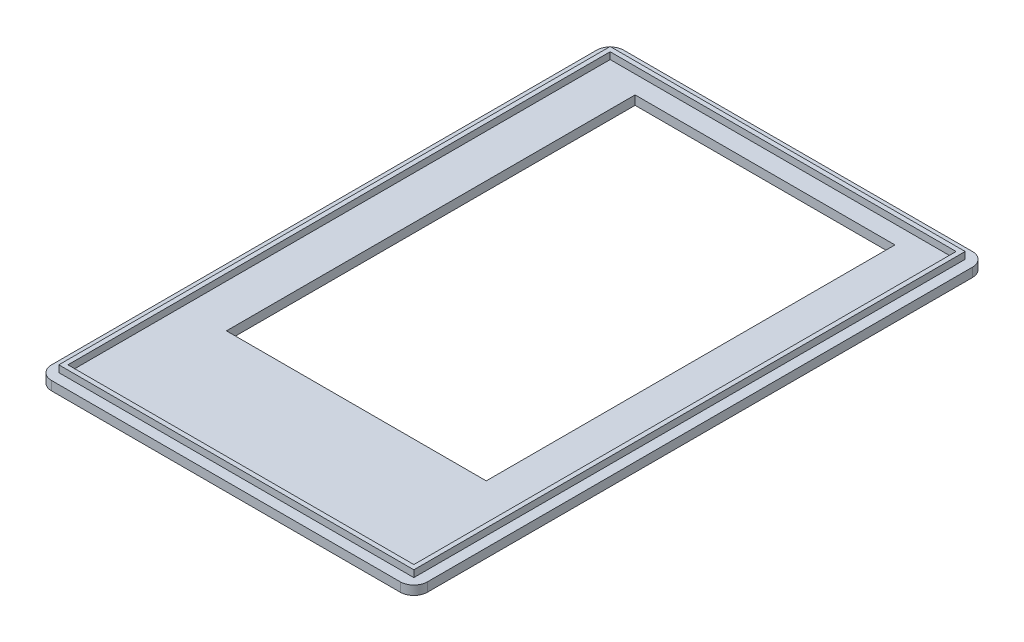
ISO-10303-21;
HEADER;
FILE_DESCRIPTION(('STEP AP214'),'2;1');
FILE_NAME('part.step','',(''),(''),'','','');
FILE_SCHEMA(('AUTOMOTIVE_DESIGN { 1 0 10303 214 1 1 1 1 }'));
ENDSEC;
DATA;
#1=APPLICATION_CONTEXT('core data for automotive mechanical design processes');
#2=APPLICATION_PROTOCOL_DEFINITION('international standard','automotive_design',2000,#1);
#3=PRODUCT_CONTEXT('',#1,'mechanical');
#4=PRODUCT('Part','Part','',(#3));
#5=PRODUCT_RELATED_PRODUCT_CATEGORY('part','',(#4));
#6=PRODUCT_DEFINITION_FORMATION('','',#4);
#7=PRODUCT_DEFINITION_CONTEXT('part definition',#1,'design');
#8=PRODUCT_DEFINITION('design','',#6,#7);
#9=PRODUCT_DEFINITION_SHAPE('','',#8);
#10=(LENGTH_UNIT() NAMED_UNIT(*) SI_UNIT(.MILLI.,.METRE.));
#11=(NAMED_UNIT(*) PLANE_ANGLE_UNIT() SI_UNIT($,.RADIAN.));
#12=(NAMED_UNIT(*) SI_UNIT($,.STERADIAN.) SOLID_ANGLE_UNIT());
#13=UNCERTAINTY_MEASURE_WITH_UNIT(LENGTH_MEASURE(1.E-05),#10,'distance_accuracy_value','');
#14=(GEOMETRIC_REPRESENTATION_CONTEXT(3) GLOBAL_UNCERTAINTY_ASSIGNED_CONTEXT((#13)) GLOBAL_UNIT_ASSIGNED_CONTEXT((#10,
#11,#12)) REPRESENTATION_CONTEXT('',''));
#15=CARTESIAN_POINT('',(0.,0.,0.));
#16=DIRECTION('',(0.,0.,1.));
#17=DIRECTION('',(1.,0.,0.));
#18=AXIS2_PLACEMENT_3D('',#15,#16,#17);
#19=CARTESIAN_POINT('',(0.,2.,0.));
#20=DIRECTION('',(0.,1.,0.));
#21=DIRECTION('',(0.,0.,1.));
#22=AXIS2_PLACEMENT_3D('',#19,#20,#21);
#23=PLANE('',#22);
#24=DIRECTION('',(1.,0.,0.));
#25=VECTOR('',#24,1.);
#26=CARTESIAN_POINT('',(-41.5,2.,-63.175));
#27=LINE('',#26,#25);
#28=CARTESIAN_POINT('',(-38.5,2.,-63.175));
#29=VERTEX_POINT('',#28);
#30=CARTESIAN_POINT('',(38.5,2.,-63.175));
#31=VERTEX_POINT('',#30);
#32=EDGE_CURVE('E307',#29,#31,#27,.T.);
#33=ORIENTED_EDGE('',*,*,#32,.F.);
#34=CARTESIAN_POINT('',(-38.5,2.,-60.175));
#35=DIRECTION('',(0.,1.,0.));
#36=DIRECTION('',(0.,0.,1.));
#37=AXIS2_PLACEMENT_3D('',#34,#35,#36);
#38=CIRCLE('',#37,3.);
#39=CARTESIAN_POINT('',(-41.5,2.,-60.175));
#40=VERTEX_POINT('',#39);
#41=EDGE_CURVE('E343',#29,#40,#38,.T.);
#42=ORIENTED_EDGE('',*,*,#41,.T.);
#43=DIRECTION('',(0.,0.,1.));
#44=VECTOR('',#43,1.);
#45=CARTESIAN_POINT('',(-41.5,2.,-63.175));
#46=LINE('',#45,#44);
#47=CARTESIAN_POINT('',(-41.5,2.,60.175));
#48=VERTEX_POINT('',#47);
#49=EDGE_CURVE('E299',#40,#48,#46,.T.);
#50=ORIENTED_EDGE('',*,*,#49,.T.);
#51=CARTESIAN_POINT('',(-38.5,2.,60.175));
#52=DIRECTION('',(0.,1.,0.));
#53=DIRECTION('',(0.,0.,1.));
#54=AXIS2_PLACEMENT_3D('',#51,#52,#53);
#55=CIRCLE('',#54,3.);
#56=CARTESIAN_POINT('',(-38.5,2.,63.175));
#57=VERTEX_POINT('',#56);
#58=EDGE_CURVE('E338',#48,#57,#55,.T.);
#59=ORIENTED_EDGE('',*,*,#58,.T.);
#60=DIRECTION('',(1.,0.,0.));
#61=VECTOR('',#60,1.);
#62=CARTESIAN_POINT('',(-41.5,2.,63.175));
#63=LINE('',#62,#61);
#64=CARTESIAN_POINT('',(38.5,2.,63.175));
#65=VERTEX_POINT('',#64);
#66=EDGE_CURVE('E302',#57,#65,#63,.T.);
#67=ORIENTED_EDGE('',*,*,#66,.T.);
#68=CARTESIAN_POINT('',(38.5,2.,60.175));
#69=DIRECTION('',(0.,1.,0.));
#70=DIRECTION('',(0.,0.,1.));
#71=AXIS2_PLACEMENT_3D('',#68,#69,#70);
#72=CIRCLE('',#71,3.);
#73=CARTESIAN_POINT('',(41.5,2.,60.175));
#74=VERTEX_POINT('',#73);
#75=EDGE_CURVE('E72',#65,#74,#72,.T.);
#76=ORIENTED_EDGE('',*,*,#75,.T.);
#77=DIRECTION('',(0.,0.,1.));
#78=VECTOR('',#77,1.);
#79=CARTESIAN_POINT('',(41.5,2.,-63.175));
#80=LINE('',#79,#78);
#81=CARTESIAN_POINT('',(41.5,2.,-60.175));
#82=VERTEX_POINT('',#81);
#83=EDGE_CURVE('E305',#82,#74,#80,.T.);
#84=ORIENTED_EDGE('',*,*,#83,.F.);
#85=CARTESIAN_POINT('',(38.5,2.,-60.175));
#86=DIRECTION('',(0.,1.,0.));
#87=DIRECTION('',(0.,0.,1.));
#88=AXIS2_PLACEMENT_3D('',#85,#86,#87);
#89=CIRCLE('',#88,3.);
#90=EDGE_CURVE('E341',#82,#31,#89,.T.);
#91=ORIENTED_EDGE('',*,*,#90,.T.);
#92=EDGE_LOOP('',(#33,#42,#50,#59,#67,#76,#84,#91));
#93=FACE_BOUND('',#92,.T.);
#94=DIRECTION('',(0.,0.,1.));
#95=VECTOR('',#94,1.);
#96=CARTESIAN_POINT('',(-39.2,2.,-60.875));
#97=LINE('',#96,#95);
#98=CARTESIAN_POINT('',(-39.2,2.,-60.875));
#99=VERTEX_POINT('',#98);
#100=CARTESIAN_POINT('',(-39.2,2.,60.875));
#101=VERTEX_POINT('',#100);
#102=EDGE_CURVE('E251',#99,#101,#97,.T.);
#103=ORIENTED_EDGE('',*,*,#102,.F.);
#104=DIRECTION('',(-1.,0.,0.));
#105=VECTOR('',#104,1.);
#106=CARTESIAN_POINT('',(39.2,2.,-60.875));
#107=LINE('',#106,#105);
#108=CARTESIAN_POINT('',(39.2,2.,-60.875));
#109=VERTEX_POINT('',#108);
#110=EDGE_CURVE('E215',#109,#99,#107,.T.);
#111=ORIENTED_EDGE('',*,*,#110,.F.);
#112=DIRECTION('',(0.,0.,-1.));
#113=VECTOR('',#112,1.);
#114=CARTESIAN_POINT('',(39.2,2.,60.875));
#115=LINE('',#114,#113);
#116=CARTESIAN_POINT('',(39.2,2.,60.875));
#117=VERTEX_POINT('',#116);
#118=EDGE_CURVE('E242',#117,#109,#115,.T.);
#119=ORIENTED_EDGE('',*,*,#118,.F.);
#120=DIRECTION('',(1.,0.,0.));
#121=VECTOR('',#120,1.);
#122=CARTESIAN_POINT('',(-39.2,2.,60.875));
#123=LINE('',#122,#121);
#124=EDGE_CURVE('E253',#101,#117,#123,.T.);
#125=ORIENTED_EDGE('',*,*,#124,.F.);
#126=EDGE_LOOP('',(#103,#111,#119,#125));
#127=FACE_BOUND('',#126,.T.);
#128=ADVANCED_FACE('F57',(#93,#127),#23,.T.);
#129=DIRECTION('',(-1.,0.,0.));
#130=VECTOR('',#129,1.);
#131=CARTESIAN_POINT('',(38.2,2.,-59.875));
#132=LINE('',#131,#130);
#133=CARTESIAN_POINT('',(38.2,2.,-59.875));
#134=VERTEX_POINT('',#133);
#135=CARTESIAN_POINT('',(-38.2,2.,-59.875));
#136=VERTEX_POINT('',#135);
#137=EDGE_CURVE('E227',#134,#136,#132,.T.);
#138=ORIENTED_EDGE('',*,*,#137,.T.);
#139=DIRECTION('',(0.,0.,1.));
#140=VECTOR('',#139,1.);
#141=CARTESIAN_POINT('',(-38.2,2.,-59.875));
#142=LINE('',#141,#140);
#143=CARTESIAN_POINT('',(-38.2,2.,59.875));
#144=VERTEX_POINT('',#143);
#145=EDGE_CURVE('E214',#136,#144,#142,.T.);
#146=ORIENTED_EDGE('',*,*,#145,.T.);
#147=DIRECTION('',(1.,0.,0.));
#148=VECTOR('',#147,1.);
#149=CARTESIAN_POINT('',(-38.2,2.,59.875));
#150=LINE('',#149,#148);
#151=CARTESIAN_POINT('',(38.2,2.,59.875));
#152=VERTEX_POINT('',#151);
#153=EDGE_CURVE('E230',#144,#152,#150,.T.);
#154=ORIENTED_EDGE('',*,*,#153,.T.);
#155=DIRECTION('',(0.,0.,-1.));
#156=VECTOR('',#155,1.);
#157=CARTESIAN_POINT('',(38.2,2.,59.875));
#158=LINE('',#157,#156);
#159=EDGE_CURVE('E207',#152,#134,#158,.T.);
#160=ORIENTED_EDGE('',*,*,#159,.T.);
#161=EDGE_LOOP('',(#138,#146,#154,#160));
#162=FACE_BOUND('',#161,.T.);
#163=DIRECTION('',(1.,0.,0.));
#164=VECTOR('',#163,1.);
#165=CARTESIAN_POINT('',(-28.69,2.,34.375));
#166=LINE('',#165,#164);
#167=CARTESIAN_POINT('',(-28.69,2.,34.375));
#168=VERTEX_POINT('',#167);
#169=CARTESIAN_POINT('',(28.69,2.,34.375));
#170=VERTEX_POINT('',#169);
#171=EDGE_CURVE('E269',#168,#170,#166,.T.);
#172=ORIENTED_EDGE('',*,*,#171,.F.);
#173=DIRECTION('',(0.,0.,1.));
#174=VECTOR('',#173,1.);
#175=CARTESIAN_POINT('',(-28.69,2.,-55.875));
#176=LINE('',#175,#174);
#177=CARTESIAN_POINT('',(-28.69,2.,-55.875));
#178=VERTEX_POINT('',#177);
#179=EDGE_CURVE('E267',#178,#168,#176,.T.);
#180=ORIENTED_EDGE('',*,*,#179,.F.);
#181=DIRECTION('',(1.,0.,0.));
#182=VECTOR('',#181,1.);
#183=CARTESIAN_POINT('',(-28.69,2.,-55.875));
#184=LINE('',#183,#182);
#185=CARTESIAN_POINT('',(28.69,2.,-55.875));
#186=VERTEX_POINT('',#185);
#187=EDGE_CURVE('E275',#178,#186,#184,.T.);
#188=ORIENTED_EDGE('',*,*,#187,.T.);
#189=DIRECTION('',(0.,0.,1.));
#190=VECTOR('',#189,1.);
#191=CARTESIAN_POINT('',(28.69,2.,-55.875));
#192=LINE('',#191,#190);
#193=EDGE_CURVE('E272',#186,#170,#192,.T.);
#194=ORIENTED_EDGE('',*,*,#193,.T.);
#195=EDGE_LOOP('',(#172,#180,#188,#194));
#196=FACE_BOUND('',#195,.T.);
#197=ADVANCED_FACE('F388',(#162,#196),#23,.T.);
#198=CARTESIAN_POINT('',(0.,0.,0.));
#199=DIRECTION('',(0.,1.,0.));
#200=DIRECTION('',(0.,0.,1.));
#201=AXIS2_PLACEMENT_3D('',#198,#199,#200);
#202=PLANE('',#201);
#203=DIRECTION('',(0.,0.,1.));
#204=VECTOR('',#203,1.);
#205=CARTESIAN_POINT('',(-41.5,0.,-63.175));
#206=LINE('',#205,#204);
#207=CARTESIAN_POINT('',(-41.5,0.,-60.175));
#208=VERTEX_POINT('',#207);
#209=CARTESIAN_POINT('',(-41.5,0.,60.175));
#210=VERTEX_POINT('',#209);
#211=EDGE_CURVE('E298',#208,#210,#206,.T.);
#212=ORIENTED_EDGE('',*,*,#211,.F.);
#213=CARTESIAN_POINT('',(-38.5,0.,-60.175));
#214=DIRECTION('',(0.,1.,0.));
#215=DIRECTION('',(0.,0.,1.));
#216=AXIS2_PLACEMENT_3D('',#213,#214,#215);
#217=CIRCLE('',#216,3.);
#218=CARTESIAN_POINT('',(-38.5,0.,-63.175));
#219=VERTEX_POINT('',#218);
#220=EDGE_CURVE('E331',#208,#219,#217,.F.);
#221=ORIENTED_EDGE('',*,*,#220,.T.);
#222=DIRECTION('',(1.,0.,0.));
#223=VECTOR('',#222,1.);
#224=CARTESIAN_POINT('',(-41.5,0.,-63.175));
#225=LINE('',#224,#223);
#226=CARTESIAN_POINT('',(38.5,0.,-63.175));
#227=VERTEX_POINT('',#226);
#228=EDGE_CURVE('E303',#219,#227,#225,.T.);
#229=ORIENTED_EDGE('',*,*,#228,.T.);
#230=CARTESIAN_POINT('',(38.5,0.,-60.175));
#231=DIRECTION('',(0.,1.,0.));
#232=DIRECTION('',(0.,0.,1.));
#233=AXIS2_PLACEMENT_3D('',#230,#231,#232);
#234=CIRCLE('',#233,3.);
#235=CARTESIAN_POINT('',(41.5,0.,-60.175));
#236=VERTEX_POINT('',#235);
#237=EDGE_CURVE('E329',#227,#236,#234,.F.);
#238=ORIENTED_EDGE('',*,*,#237,.T.);
#239=DIRECTION('',(0.,0.,1.));
#240=VECTOR('',#239,1.);
#241=CARTESIAN_POINT('',(41.5,0.,-63.175));
#242=LINE('',#241,#240);
#243=CARTESIAN_POINT('',(41.5,0.,60.175));
#244=VERTEX_POINT('',#243);
#245=EDGE_CURVE('E316',#236,#244,#242,.T.);
#246=ORIENTED_EDGE('',*,*,#245,.T.);
#247=CARTESIAN_POINT('',(38.5,0.,60.175));
#248=DIRECTION('',(0.,1.,0.));
#249=DIRECTION('',(0.,0.,1.));
#250=AXIS2_PLACEMENT_3D('',#247,#248,#249);
#251=CIRCLE('',#250,3.);
#252=CARTESIAN_POINT('',(38.5,0.,63.175));
#253=VERTEX_POINT('',#252);
#254=EDGE_CURVE('E327',#244,#253,#251,.F.);
#255=ORIENTED_EDGE('',*,*,#254,.T.);
#256=DIRECTION('',(1.,0.,0.));
#257=VECTOR('',#256,1.);
#258=CARTESIAN_POINT('',(-41.5,0.,63.175));
#259=LINE('',#258,#257);
#260=CARTESIAN_POINT('',(-38.5,0.,63.175));
#261=VERTEX_POINT('',#260);
#262=EDGE_CURVE('E313',#261,#253,#259,.T.);
#263=ORIENTED_EDGE('',*,*,#262,.F.);
#264=CARTESIAN_POINT('',(-38.5,0.,60.175));
#265=DIRECTION('',(0.,1.,0.));
#266=DIRECTION('',(0.,0.,1.));
#267=AXIS2_PLACEMENT_3D('',#264,#265,#266);
#268=CIRCLE('',#267,3.);
#269=EDGE_CURVE('E325',#261,#210,#268,.F.);
#270=ORIENTED_EDGE('',*,*,#269,.T.);
#271=EDGE_LOOP('',(#212,#221,#229,#238,#246,#255,#263,#270));
#272=FACE_BOUND('',#271,.T.);
#273=DIRECTION('',(0.,0.,1.));
#274=VECTOR('',#273,1.);
#275=CARTESIAN_POINT('',(-28.69,0.,-55.875));
#276=LINE('',#275,#274);
#277=CARTESIAN_POINT('',(-28.69,0.,-55.875));
#278=VERTEX_POINT('',#277);
#279=CARTESIAN_POINT('',(-28.69,0.,34.375));
#280=VERTEX_POINT('',#279);
#281=EDGE_CURVE('E266',#278,#280,#276,.T.);
#282=ORIENTED_EDGE('',*,*,#281,.T.);
#283=DIRECTION('',(1.,0.,0.));
#284=VECTOR('',#283,1.);
#285=CARTESIAN_POINT('',(-28.69,0.,34.375));
#286=LINE('',#285,#284);
#287=CARTESIAN_POINT('',(28.69,0.,34.375));
#288=VERTEX_POINT('',#287);
#289=EDGE_CURVE('E281',#280,#288,#286,.T.);
#290=ORIENTED_EDGE('',*,*,#289,.T.);
#291=DIRECTION('',(0.,0.,1.));
#292=VECTOR('',#291,1.);
#293=CARTESIAN_POINT('',(28.69,0.,-55.875));
#294=LINE('',#293,#292);
#295=CARTESIAN_POINT('',(28.69,0.,-55.875));
#296=VERTEX_POINT('',#295);
#297=EDGE_CURVE('E284',#296,#288,#294,.T.);
#298=ORIENTED_EDGE('',*,*,#297,.F.);
#299=DIRECTION('',(1.,0.,0.));
#300=VECTOR('',#299,1.);
#301=CARTESIAN_POINT('',(-28.69,0.,-55.875));
#302=LINE('',#301,#300);
#303=EDGE_CURVE('E270',#278,#296,#302,.T.);
#304=ORIENTED_EDGE('',*,*,#303,.F.);
#305=EDGE_LOOP('',(#282,#290,#298,#304));
#306=FACE_BOUND('',#305,.T.);
#307=ADVANCED_FACE('F359',(#272,#306),#202,.F.);
#308=CARTESIAN_POINT('',(-41.5,2.,-63.175));
#309=DIRECTION('',(1.,0.,0.));
#310=DIRECTION('',(0.,0.,-1.));
#311=AXIS2_PLACEMENT_3D('',#308,#309,#310);
#312=PLANE('',#311);
#313=ORIENTED_EDGE('',*,*,#49,.F.);
#314=DIRECTION('',(0.,-1.,0.));
#315=VECTOR('',#314,1.);
#316=CARTESIAN_POINT('',(-41.5,0.,-60.175));
#317=LINE('',#316,#315);
#318=EDGE_CURVE('E322',#40,#208,#317,.T.);
#319=ORIENTED_EDGE('',*,*,#318,.T.);
#320=ORIENTED_EDGE('',*,*,#211,.T.);
#321=DIRECTION('',(0.,-1.,0.));
#322=VECTOR('',#321,1.);
#323=CARTESIAN_POINT('',(-41.5,2.,60.175));
#324=LINE('',#323,#322);
#325=EDGE_CURVE('E310',#210,#48,#324,.F.);
#326=ORIENTED_EDGE('',*,*,#325,.T.);
#327=EDGE_LOOP('',(#313,#319,#320,#326));
#328=FACE_BOUND('',#327,.T.);
#329=ADVANCED_FACE('F381',(#328),#312,.F.);
#330=CARTESIAN_POINT('',(-41.5,2.,63.175));
#331=DIRECTION('',(0.,0.,-1.));
#332=DIRECTION('',(-1.,0.,0.));
#333=AXIS2_PLACEMENT_3D('',#330,#331,#332);
#334=PLANE('',#333);
#335=ORIENTED_EDGE('',*,*,#262,.T.);
#336=DIRECTION('',(0.,-1.,0.));
#337=VECTOR('',#336,1.);
#338=CARTESIAN_POINT('',(38.5,2.,63.175));
#339=LINE('',#338,#337);
#340=EDGE_CURVE('E12',#253,#65,#339,.F.);
#341=ORIENTED_EDGE('',*,*,#340,.T.);
#342=ORIENTED_EDGE('',*,*,#66,.F.);
#343=DIRECTION('',(0.,-1.,0.));
#344=VECTOR('',#343,1.);
#345=CARTESIAN_POINT('',(-38.5,2.,63.175));
#346=LINE('',#345,#344);
#347=EDGE_CURVE('E65',#57,#261,#346,.T.);
#348=ORIENTED_EDGE('',*,*,#347,.T.);
#349=EDGE_LOOP('',(#335,#341,#342,#348));
#350=FACE_BOUND('',#349,.T.);
#351=ADVANCED_FACE('F353',(#350),#334,.F.);
#352=CARTESIAN_POINT('',(41.5,2.,-63.175));
#353=DIRECTION('',(1.,0.,0.));
#354=DIRECTION('',(0.,0.,-1.));
#355=AXIS2_PLACEMENT_3D('',#352,#353,#354);
#356=PLANE('',#355);
#357=ORIENTED_EDGE('',*,*,#245,.F.);
#358=DIRECTION('',(0.,-1.,0.));
#359=VECTOR('',#358,1.);
#360=CARTESIAN_POINT('',(41.5,2.,-60.175));
#361=LINE('',#360,#359);
#362=EDGE_CURVE('E79',#236,#82,#361,.F.);
#363=ORIENTED_EDGE('',*,*,#362,.T.);
#364=ORIENTED_EDGE('',*,*,#83,.T.);
#365=DIRECTION('',(0.,-1.,0.));
#366=VECTOR('',#365,1.);
#367=CARTESIAN_POINT('',(41.5,0.,60.175));
#368=LINE('',#367,#366);
#369=EDGE_CURVE('E345',#74,#244,#368,.T.);
#370=ORIENTED_EDGE('',*,*,#369,.T.);
#371=EDGE_LOOP('',(#357,#363,#364,#370));
#372=FACE_BOUND('',#371,.T.);
#373=ADVANCED_FACE('F364',(#372),#356,.T.);
#374=CARTESIAN_POINT('',(-41.5,2.,-63.175));
#375=DIRECTION('',(0.,0.,-1.));
#376=DIRECTION('',(-1.,0.,0.));
#377=AXIS2_PLACEMENT_3D('',#374,#375,#376);
#378=PLANE('',#377);
#379=ORIENTED_EDGE('',*,*,#228,.F.);
#380=DIRECTION('',(0.,-1.,0.));
#381=VECTOR('',#380,1.);
#382=CARTESIAN_POINT('',(-38.5,2.,-63.175));
#383=LINE('',#382,#381);
#384=EDGE_CURVE('E336',#219,#29,#383,.F.);
#385=ORIENTED_EDGE('',*,*,#384,.T.);
#386=ORIENTED_EDGE('',*,*,#32,.T.);
#387=DIRECTION('',(0.,-1.,0.));
#388=VECTOR('',#387,1.);
#389=CARTESIAN_POINT('',(38.5,2.,-63.175));
#390=LINE('',#389,#388);
#391=EDGE_CURVE('E333',#31,#227,#390,.T.);
#392=ORIENTED_EDGE('',*,*,#391,.T.);
#393=EDGE_LOOP('',(#379,#385,#386,#392));
#394=FACE_BOUND('',#393,.T.);
#395=ADVANCED_FACE('F373',(#394),#378,.T.);
#396=CARTESIAN_POINT('',(-28.69,2.,-55.875));
#397=DIRECTION('',(1.,0.,0.));
#398=DIRECTION('',(0.,0.,-1.));
#399=AXIS2_PLACEMENT_3D('',#396,#397,#398);
#400=PLANE('',#399);
#401=ORIENTED_EDGE('',*,*,#281,.F.);
#402=DIRECTION('',(0.,-1.,0.));
#403=VECTOR('',#402,1.);
#404=CARTESIAN_POINT('',(-28.69,2.,-55.875));
#405=LINE('',#404,#403);
#406=EDGE_CURVE('E278',#178,#278,#405,.T.);
#407=ORIENTED_EDGE('',*,*,#406,.F.);
#408=ORIENTED_EDGE('',*,*,#179,.T.);
#409=DIRECTION('',(0.,-1.,0.));
#410=VECTOR('',#409,1.);
#411=CARTESIAN_POINT('',(-28.69,2.,34.375));
#412=LINE('',#411,#410);
#413=EDGE_CURVE('E295',#168,#280,#412,.T.);
#414=ORIENTED_EDGE('',*,*,#413,.T.);
#415=EDGE_LOOP('',(#401,#407,#408,#414));
#416=FACE_BOUND('',#415,.T.);
#417=ADVANCED_FACE('F396',(#416),#400,.T.);
#418=CARTESIAN_POINT('',(-28.69,2.,34.375));
#419=DIRECTION('',(0.,0.,-1.));
#420=DIRECTION('',(-1.,0.,0.));
#421=AXIS2_PLACEMENT_3D('',#418,#419,#420);
#422=PLANE('',#421);
#423=ORIENTED_EDGE('',*,*,#289,.F.);
#424=ORIENTED_EDGE('',*,*,#413,.F.);
#425=ORIENTED_EDGE('',*,*,#171,.T.);
#426=DIRECTION('',(0.,-1.,0.));
#427=VECTOR('',#426,1.);
#428=CARTESIAN_POINT('',(28.69,2.,34.375));
#429=LINE('',#428,#427);
#430=EDGE_CURVE('E293',#170,#288,#429,.T.);
#431=ORIENTED_EDGE('',*,*,#430,.T.);
#432=EDGE_LOOP('',(#423,#424,#425,#431));
#433=FACE_BOUND('',#432,.T.);
#434=ADVANCED_FACE('F532',(#433),#422,.T.);
#435=CARTESIAN_POINT('',(28.69,2.,-55.875));
#436=DIRECTION('',(1.,0.,0.));
#437=DIRECTION('',(0.,0.,-1.));
#438=AXIS2_PLACEMENT_3D('',#435,#436,#437);
#439=PLANE('',#438);
#440=ORIENTED_EDGE('',*,*,#297,.T.);
#441=ORIENTED_EDGE('',*,*,#430,.F.);
#442=ORIENTED_EDGE('',*,*,#193,.F.);
#443=DIRECTION('',(0.,-1.,0.));
#444=VECTOR('',#443,1.);
#445=CARTESIAN_POINT('',(28.69,2.,-55.875));
#446=LINE('',#445,#444);
#447=EDGE_CURVE('E291',#186,#296,#446,.T.);
#448=ORIENTED_EDGE('',*,*,#447,.T.);
#449=EDGE_LOOP('',(#440,#441,#442,#448));
#450=FACE_BOUND('',#449,.T.);
#451=ADVANCED_FACE('F523',(#450),#439,.F.);
#452=CARTESIAN_POINT('',(-28.69,2.,-55.875));
#453=DIRECTION('',(0.,0.,-1.));
#454=DIRECTION('',(-1.,0.,0.));
#455=AXIS2_PLACEMENT_3D('',#452,#453,#454);
#456=PLANE('',#455);
#457=ORIENTED_EDGE('',*,*,#303,.T.);
#458=ORIENTED_EDGE('',*,*,#447,.F.);
#459=ORIENTED_EDGE('',*,*,#187,.F.);
#460=ORIENTED_EDGE('',*,*,#406,.T.);
#461=EDGE_LOOP('',(#457,#458,#459,#460));
#462=FACE_BOUND('',#461,.T.);
#463=ADVANCED_FACE('F508',(#462),#456,.F.);
#464=CARTESIAN_POINT('',(0.,3.5,0.));
#465=DIRECTION('',(0.,1.,0.));
#466=DIRECTION('',(0.,0.,1.));
#467=AXIS2_PLACEMENT_3D('',#464,#465,#466);
#468=PLANE('',#467);
#469=DIRECTION('',(-1.,0.,0.));
#470=VECTOR('',#469,1.);
#471=CARTESIAN_POINT('',(39.2,3.5,-60.875));
#472=LINE('',#471,#470);
#473=CARTESIAN_POINT('',(39.2,3.5,-60.875));
#474=VERTEX_POINT('',#473);
#475=CARTESIAN_POINT('',(-39.2,3.5,-60.875));
#476=VERTEX_POINT('',#475);
#477=EDGE_CURVE('E238',#474,#476,#472,.T.);
#478=ORIENTED_EDGE('',*,*,#477,.T.);
#479=DIRECTION('',(0.,0.,1.));
#480=VECTOR('',#479,1.);
#481=CARTESIAN_POINT('',(-39.2,3.5,-60.875));
#482=LINE('',#481,#480);
#483=CARTESIAN_POINT('',(-39.2,3.5,60.875));
#484=VERTEX_POINT('',#483);
#485=EDGE_CURVE('E241',#476,#484,#482,.T.);
#486=ORIENTED_EDGE('',*,*,#485,.T.);
#487=DIRECTION('',(1.,0.,0.));
#488=VECTOR('',#487,1.);
#489=CARTESIAN_POINT('',(-39.2,3.5,60.875));
#490=LINE('',#489,#488);
#491=CARTESIAN_POINT('',(39.2,3.5,60.875));
#492=VERTEX_POINT('',#491);
#493=EDGE_CURVE('E244',#484,#492,#490,.T.);
#494=ORIENTED_EDGE('',*,*,#493,.T.);
#495=DIRECTION('',(0.,0.,-1.));
#496=VECTOR('',#495,1.);
#497=CARTESIAN_POINT('',(39.2,3.5,60.875));
#498=LINE('',#497,#496);
#499=EDGE_CURVE('E246',#492,#474,#498,.T.);
#500=ORIENTED_EDGE('',*,*,#499,.T.);
#501=EDGE_LOOP('',(#478,#486,#494,#500));
#502=FACE_BOUND('',#501,.T.);
#503=DIRECTION('',(0.,0.,1.));
#504=VECTOR('',#503,1.);
#505=CARTESIAN_POINT('',(-38.2,3.5,-59.875));
#506=LINE('',#505,#504);
#507=CARTESIAN_POINT('',(-38.2,3.5,-59.875));
#508=VERTEX_POINT('',#507);
#509=CARTESIAN_POINT('',(-38.2,3.5,59.875));
#510=VERTEX_POINT('',#509);
#511=EDGE_CURVE('E206',#508,#510,#506,.T.);
#512=ORIENTED_EDGE('',*,*,#511,.F.);
#513=DIRECTION('',(-1.,0.,0.));
#514=VECTOR('',#513,1.);
#515=CARTESIAN_POINT('',(38.2,3.5,-59.875));
#516=LINE('',#515,#514);
#517=CARTESIAN_POINT('',(38.2,3.5,-59.875));
#518=VERTEX_POINT('',#517);
#519=EDGE_CURVE('E196',#518,#508,#516,.T.);
#520=ORIENTED_EDGE('',*,*,#519,.F.);
#521=DIRECTION('',(0.,0.,-1.));
#522=VECTOR('',#521,1.);
#523=CARTESIAN_POINT('',(38.2,3.5,59.875));
#524=LINE('',#523,#522);
#525=CARTESIAN_POINT('',(38.2,3.5,59.875));
#526=VERTEX_POINT('',#525);
#527=EDGE_CURVE('E223',#526,#518,#524,.T.);
#528=ORIENTED_EDGE('',*,*,#527,.F.);
#529=DIRECTION('',(1.,0.,0.));
#530=VECTOR('',#529,1.);
#531=CARTESIAN_POINT('',(-38.2,3.5,59.875));
#532=LINE('',#531,#530);
#533=EDGE_CURVE('E221',#510,#526,#532,.T.);
#534=ORIENTED_EDGE('',*,*,#533,.F.);
#535=EDGE_LOOP('',(#512,#520,#528,#534));
#536=FACE_BOUND('',#535,.T.);
#537=ADVANCED_FACE('F219',(#502,#536),#468,.T.);
#538=CARTESIAN_POINT('',(39.2,3.5,-60.875));
#539=DIRECTION('',(0.,0.,1.));
#540=DIRECTION('',(1.,0.,0.));
#541=AXIS2_PLACEMENT_3D('',#538,#539,#540);
#542=PLANE('',#541);
#543=ORIENTED_EDGE('',*,*,#110,.T.);
#544=DIRECTION('',(0.,-1.,0.));
#545=VECTOR('',#544,1.);
#546=CARTESIAN_POINT('',(-39.2,3.5,-60.875));
#547=LINE('',#546,#545);
#548=EDGE_CURVE('E264',#476,#99,#547,.T.);
#549=ORIENTED_EDGE('',*,*,#548,.F.);
#550=ORIENTED_EDGE('',*,*,#477,.F.);
#551=DIRECTION('',(0.,-1.,0.));
#552=VECTOR('',#551,1.);
#553=CARTESIAN_POINT('',(39.2,3.5,-60.875));
#554=LINE('',#553,#552);
#555=EDGE_CURVE('E248',#474,#109,#554,.T.);
#556=ORIENTED_EDGE('',*,*,#555,.T.);
#557=EDGE_LOOP('',(#543,#549,#550,#556));
#558=FACE_BOUND('',#557,.T.);
#559=ADVANCED_FACE('F491',(#558),#542,.F.);
#560=CARTESIAN_POINT('',(-39.2,3.5,-60.875));
#561=DIRECTION('',(1.,0.,0.));
#562=DIRECTION('',(0.,0.,-1.));
#563=AXIS2_PLACEMENT_3D('',#560,#561,#562);
#564=PLANE('',#563);
#565=ORIENTED_EDGE('',*,*,#102,.T.);
#566=DIRECTION('',(0.,-1.,0.));
#567=VECTOR('',#566,1.);
#568=CARTESIAN_POINT('',(-39.2,3.5,60.875));
#569=LINE('',#568,#567);
#570=EDGE_CURVE('E261',#484,#101,#569,.T.);
#571=ORIENTED_EDGE('',*,*,#570,.F.);
#572=ORIENTED_EDGE('',*,*,#485,.F.);
#573=ORIENTED_EDGE('',*,*,#548,.T.);
#574=EDGE_LOOP('',(#565,#571,#572,#573));
#575=FACE_BOUND('',#574,.T.);
#576=ADVANCED_FACE('F482',(#575),#564,.F.);
#577=CARTESIAN_POINT('',(-39.2,3.5,60.875));
#578=DIRECTION('',(0.,0.,-1.));
#579=DIRECTION('',(-1.,0.,0.));
#580=AXIS2_PLACEMENT_3D('',#577,#578,#579);
#581=PLANE('',#580);
#582=ORIENTED_EDGE('',*,*,#124,.T.);
#583=DIRECTION('',(0.,-1.,0.));
#584=VECTOR('',#583,1.);
#585=CARTESIAN_POINT('',(39.2,3.5,60.875));
#586=LINE('',#585,#584);
#587=EDGE_CURVE('E259',#492,#117,#586,.T.);
#588=ORIENTED_EDGE('',*,*,#587,.F.);
#589=ORIENTED_EDGE('',*,*,#493,.F.);
#590=ORIENTED_EDGE('',*,*,#570,.T.);
#591=EDGE_LOOP('',(#582,#588,#589,#590));
#592=FACE_BOUND('',#591,.T.);
#593=ADVANCED_FACE('F473',(#592),#581,.F.);
#594=CARTESIAN_POINT('',(39.2,3.5,60.875));
#595=DIRECTION('',(-1.,0.,0.));
#596=DIRECTION('',(0.,0.,1.));
#597=AXIS2_PLACEMENT_3D('',#594,#595,#596);
#598=PLANE('',#597);
#599=ORIENTED_EDGE('',*,*,#118,.T.);
#600=ORIENTED_EDGE('',*,*,#555,.F.);
#601=ORIENTED_EDGE('',*,*,#499,.F.);
#602=ORIENTED_EDGE('',*,*,#587,.T.);
#603=EDGE_LOOP('',(#599,#600,#601,#602));
#604=FACE_BOUND('',#603,.T.);
#605=ADVANCED_FACE('F465',(#604),#598,.F.);
#606=CARTESIAN_POINT('',(38.2,3.5,-59.875));
#607=DIRECTION('',(0.,0.,1.));
#608=DIRECTION('',(1.,0.,0.));
#609=AXIS2_PLACEMENT_3D('',#606,#607,#608);
#610=PLANE('',#609);
#611=ORIENTED_EDGE('',*,*,#137,.F.);
#612=DIRECTION('',(0.,-1.,0.));
#613=VECTOR('',#612,1.);
#614=CARTESIAN_POINT('',(38.2,3.5,-59.875));
#615=LINE('',#614,#613);
#616=EDGE_CURVE('E202',#518,#134,#615,.T.);
#617=ORIENTED_EDGE('',*,*,#616,.F.);
#618=ORIENTED_EDGE('',*,*,#519,.T.);
#619=DIRECTION('',(0.,-1.,0.));
#620=VECTOR('',#619,1.);
#621=CARTESIAN_POINT('',(-38.2,3.5,-59.875));
#622=LINE('',#621,#620);
#623=EDGE_CURVE('E200',#508,#136,#622,.T.);
#624=ORIENTED_EDGE('',*,*,#623,.T.);
#625=EDGE_LOOP('',(#611,#617,#618,#624));
#626=FACE_BOUND('',#625,.T.);
#627=ADVANCED_FACE('F199',(#626),#610,.T.);
#628=CARTESIAN_POINT('',(-38.2,3.5,-59.875));
#629=DIRECTION('',(1.,0.,0.));
#630=DIRECTION('',(0.,0.,-1.));
#631=AXIS2_PLACEMENT_3D('',#628,#629,#630);
#632=PLANE('',#631);
#633=ORIENTED_EDGE('',*,*,#145,.F.);
#634=ORIENTED_EDGE('',*,*,#623,.F.);
#635=ORIENTED_EDGE('',*,*,#511,.T.);
#636=DIRECTION('',(0.,-1.,0.));
#637=VECTOR('',#636,1.);
#638=CARTESIAN_POINT('',(-38.2,3.5,59.875));
#639=LINE('',#638,#637);
#640=EDGE_CURVE('E216',#510,#144,#639,.T.);
#641=ORIENTED_EDGE('',*,*,#640,.T.);
#642=EDGE_LOOP('',(#633,#634,#635,#641));
#643=FACE_BOUND('',#642,.T.);
#644=ADVANCED_FACE('F211',(#643),#632,.T.);
#645=CARTESIAN_POINT('',(-38.2,3.5,59.875));
#646=DIRECTION('',(0.,0.,-1.));
#647=DIRECTION('',(-1.,0.,0.));
#648=AXIS2_PLACEMENT_3D('',#645,#646,#647);
#649=PLANE('',#648);
#650=ORIENTED_EDGE('',*,*,#153,.F.);
#651=ORIENTED_EDGE('',*,*,#640,.F.);
#652=ORIENTED_EDGE('',*,*,#533,.T.);
#653=DIRECTION('',(0.,-1.,0.));
#654=VECTOR('',#653,1.);
#655=CARTESIAN_POINT('',(38.2,3.5,59.875));
#656=LINE('',#655,#654);
#657=EDGE_CURVE('E234',#526,#152,#656,.T.);
#658=ORIENTED_EDGE('',*,*,#657,.T.);
#659=EDGE_LOOP('',(#650,#651,#652,#658));
#660=FACE_BOUND('',#659,.T.);
#661=ADVANCED_FACE('F441',(#660),#649,.T.);
#662=CARTESIAN_POINT('',(38.2,3.5,59.875));
#663=DIRECTION('',(-1.,0.,0.));
#664=DIRECTION('',(0.,0.,1.));
#665=AXIS2_PLACEMENT_3D('',#662,#663,#664);
#666=PLANE('',#665);
#667=ORIENTED_EDGE('',*,*,#159,.F.);
#668=ORIENTED_EDGE('',*,*,#657,.F.);
#669=ORIENTED_EDGE('',*,*,#527,.T.);
#670=ORIENTED_EDGE('',*,*,#616,.T.);
#671=EDGE_LOOP('',(#667,#668,#669,#670));
#672=FACE_BOUND('',#671,.T.);
#673=ADVANCED_FACE('F410',(#672),#666,.T.);
#674=CARTESIAN_POINT('',(-38.5,2.,-60.175));
#675=DIRECTION('',(0.,1.,0.));
#676=DIRECTION('',(0.,0.,1.));
#677=AXIS2_PLACEMENT_3D('',#674,#675,#676);
#678=CYLINDRICAL_SURFACE('',#677,3.);
#679=ORIENTED_EDGE('',*,*,#41,.F.);
#680=ORIENTED_EDGE('',*,*,#384,.F.);
#681=ORIENTED_EDGE('',*,*,#220,.F.);
#682=ORIENTED_EDGE('',*,*,#318,.F.);
#683=EDGE_LOOP('',(#679,#680,#681,#682));
#684=FACE_BOUND('',#683,.T.);
#685=ADVANCED_FACE('F378',(#684),#678,.T.);
#686=CARTESIAN_POINT('',(38.5,2.,-60.175));
#687=DIRECTION('',(0.,-1.,0.));
#688=DIRECTION('',(0.,0.,-1.));
#689=AXIS2_PLACEMENT_3D('',#686,#687,#688);
#690=CYLINDRICAL_SURFACE('',#689,3.);
#691=ORIENTED_EDGE('',*,*,#90,.F.);
#692=ORIENTED_EDGE('',*,*,#362,.F.);
#693=ORIENTED_EDGE('',*,*,#237,.F.);
#694=ORIENTED_EDGE('',*,*,#391,.F.);
#695=EDGE_LOOP('',(#691,#692,#693,#694));
#696=FACE_BOUND('',#695,.T.);
#697=ADVANCED_FACE('F370',(#696),#690,.T.);
#698=CARTESIAN_POINT('',(38.5,2.,60.175));
#699=DIRECTION('',(0.,1.,0.));
#700=DIRECTION('',(0.,0.,1.));
#701=AXIS2_PLACEMENT_3D('',#698,#699,#700);
#702=CYLINDRICAL_SURFACE('',#701,3.);
#703=ORIENTED_EDGE('',*,*,#75,.F.);
#704=ORIENTED_EDGE('',*,*,#340,.F.);
#705=ORIENTED_EDGE('',*,*,#254,.F.);
#706=ORIENTED_EDGE('',*,*,#369,.F.);
#707=EDGE_LOOP('',(#703,#704,#705,#706));
#708=FACE_BOUND('',#707,.T.);
#709=ADVANCED_FACE('F363',(#708),#702,.T.);
#710=CARTESIAN_POINT('',(-38.5,2.,60.175));
#711=DIRECTION('',(0.,-1.,0.));
#712=DIRECTION('',(0.,0.,-1.));
#713=AXIS2_PLACEMENT_3D('',#710,#711,#712);
#714=CYLINDRICAL_SURFACE('',#713,3.);
#715=ORIENTED_EDGE('',*,*,#58,.F.);
#716=ORIENTED_EDGE('',*,*,#325,.F.);
#717=ORIENTED_EDGE('',*,*,#269,.F.);
#718=ORIENTED_EDGE('',*,*,#347,.F.);
#719=EDGE_LOOP('',(#715,#716,#717,#718));
#720=FACE_BOUND('',#719,.T.);
#721=ADVANCED_FACE('F59',(#720),#714,.T.);
#722=CLOSED_SHELL('',(#128,#197,#307,#329,#351,#373,#395,#417,#434,#451,#463,#537,#559,#576,
#593,#605,#627,#644,#661,#673,#685,#697,#709,#721));
#723=MANIFOLD_SOLID_BREP('B2',#722);
#724=ADVANCED_BREP_SHAPE_REPRESENTATION('',(#18,#723),#14);
#725=SHAPE_DEFINITION_REPRESENTATION(#9,#724);
ENDSEC;
END-ISO-10303-21;
